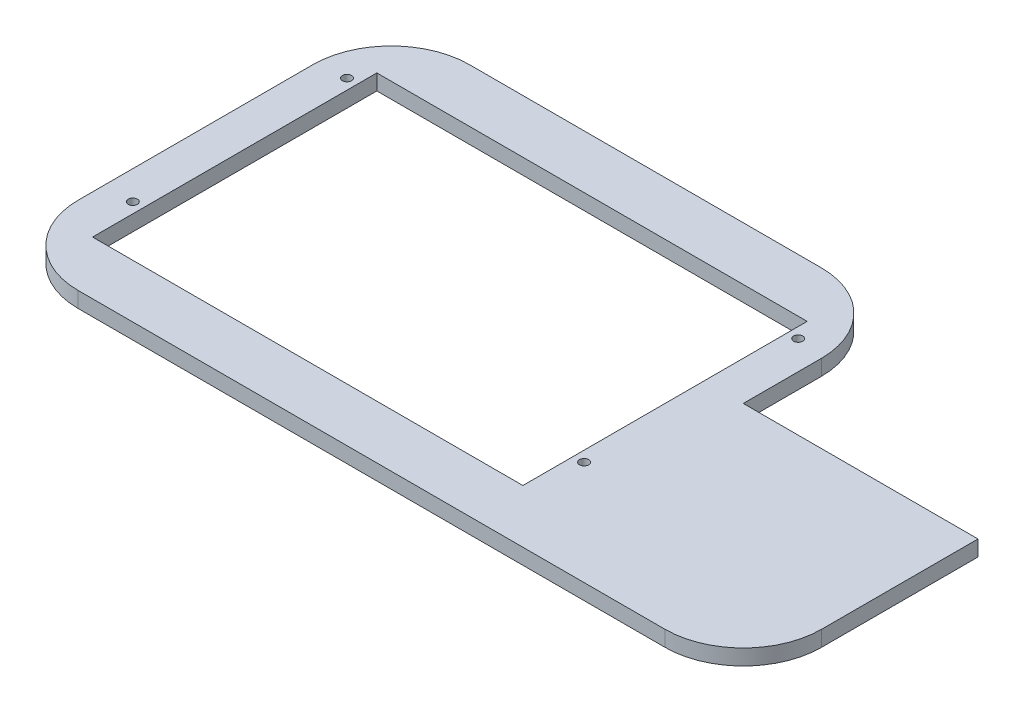
ISO-10303-21;
HEADER;
FILE_DESCRIPTION(('STEP AP214'),'2;1');
FILE_NAME('part.step','',(''),(''),'','','');
FILE_SCHEMA(('AUTOMOTIVE_DESIGN { 1 0 10303 214 1 1 1 1 }'));
ENDSEC;
DATA;
#1=APPLICATION_CONTEXT('core data for automotive mechanical design processes');
#2=APPLICATION_PROTOCOL_DEFINITION('international standard','automotive_design',2000,#1);
#3=PRODUCT_CONTEXT('',#1,'mechanical');
#4=PRODUCT('Part','Part','',(#3));
#5=PRODUCT_RELATED_PRODUCT_CATEGORY('part','',(#4));
#6=PRODUCT_DEFINITION_FORMATION('','',#4);
#7=PRODUCT_DEFINITION_CONTEXT('part definition',#1,'design');
#8=PRODUCT_DEFINITION('design','',#6,#7);
#9=PRODUCT_DEFINITION_SHAPE('','',#8);
#10=(LENGTH_UNIT() NAMED_UNIT(*) SI_UNIT(.MILLI.,.METRE.));
#11=(NAMED_UNIT(*) PLANE_ANGLE_UNIT() SI_UNIT($,.RADIAN.));
#12=(NAMED_UNIT(*) SI_UNIT($,.STERADIAN.) SOLID_ANGLE_UNIT());
#13=UNCERTAINTY_MEASURE_WITH_UNIT(LENGTH_MEASURE(1.E-05),#10,'distance_accuracy_value','');
#14=(GEOMETRIC_REPRESENTATION_CONTEXT(3) GLOBAL_UNCERTAINTY_ASSIGNED_CONTEXT((#13)) GLOBAL_UNIT_ASSIGNED_CONTEXT((#10,
#11,#12)) REPRESENTATION_CONTEXT('',''));
#15=CARTESIAN_POINT('',(0.,0.,0.));
#16=DIRECTION('',(0.,0.,1.));
#17=DIRECTION('',(1.,0.,0.));
#18=AXIS2_PLACEMENT_3D('',#15,#16,#17);
#19=CARTESIAN_POINT('',(30.,6.,-30.));
#20=DIRECTION('',(0.,1.,0.));
#21=DIRECTION('',(0.,0.,1.));
#22=AXIS2_PLACEMENT_3D('',#19,#20,#21);
#23=PLANE('',#22);
#24=CARTESIAN_POINT('',(184.,6.,-122.05));
#25=DIRECTION('',(0.,1.,0.));
#26=DIRECTION('',(0.,0.,-1.));
#27=AXIS2_PLACEMENT_3D('',#24,#25,#26);
#28=CIRCLE('',#27,1.74999999999998);
#29=CARTESIAN_POINT('',(184.,6.,-123.8));
#30=VERTEX_POINT('',#29);
#31=EDGE_CURVE('E467',#30,#30,#28,.T.);
#32=ORIENTED_EDGE('',*,*,#31,.F.);
#33=EDGE_LOOP('',(#32));
#34=FACE_BOUND('',#33,.T.);
#35=CARTESIAN_POINT('',(184.,6.,-39.95));
#36=DIRECTION('',(0.,1.,0.));
#37=DIRECTION('',(0.,0.,1.));
#38=AXIS2_PLACEMENT_3D('',#35,#36,#37);
#39=CIRCLE('',#38,1.74999999999998);
#40=CARTESIAN_POINT('',(184.,6.,-38.2));
#41=VERTEX_POINT('',#40);
#42=EDGE_CURVE('E471',#41,#41,#39,.T.);
#43=ORIENTED_EDGE('',*,*,#42,.F.);
#44=EDGE_LOOP('',(#43));
#45=FACE_BOUND('',#44,.T.);
#46=CARTESIAN_POINT('',(11.,6.,-39.95));
#47=DIRECTION('',(0.,1.,0.));
#48=DIRECTION('',(0.,0.,-1.));
#49=AXIS2_PLACEMENT_3D('',#46,#47,#48);
#50=CIRCLE('',#49,1.75);
#51=CARTESIAN_POINT('',(11.,6.,-41.7));
#52=VERTEX_POINT('',#51);
#53=EDGE_CURVE('E481',#52,#52,#50,.T.);
#54=ORIENTED_EDGE('',*,*,#53,.F.);
#55=EDGE_LOOP('',(#54));
#56=FACE_BOUND('',#55,.T.);
#57=CARTESIAN_POINT('',(11.,6.,-122.05));
#58=DIRECTION('',(0.,1.,0.));
#59=DIRECTION('',(0.,0.,1.));
#60=AXIS2_PLACEMENT_3D('',#57,#58,#59);
#61=CIRCLE('',#60,1.75);
#62=CARTESIAN_POINT('',(11.,6.,-120.3));
#63=VERTEX_POINT('',#62);
#64=EDGE_CURVE('E166',#63,#63,#61,.T.);
#65=ORIENTED_EDGE('',*,*,#64,.F.);
#66=EDGE_LOOP('',(#65));
#67=FACE_BOUND('',#66,.T.);
#68=CARTESIAN_POINT('',(30.,6.,-30.));
#69=DIRECTION('',(0.,1.,0.));
#70=DIRECTION('',(0.,0.,1.));
#71=AXIS2_PLACEMENT_3D('',#68,#69,#70);
#72=CIRCLE('',#71,30.);
#73=CARTESIAN_POINT('',(0.,6.,-30.0000000000002));
#74=VERTEX_POINT('',#73);
#75=CARTESIAN_POINT('',(30.0000000000002,6.,0.));
#76=VERTEX_POINT('',#75);
#77=EDGE_CURVE('E176',#74,#76,#72,.T.);
#78=ORIENTED_EDGE('',*,*,#77,.T.);
#79=DIRECTION('',(1.,0.,0.));
#80=VECTOR('',#79,1.);
#81=CARTESIAN_POINT('',(30.0000000000002,6.,0.));
#82=LINE('',#81,#80);
#83=CARTESIAN_POINT('',(255.,6.,0.));
#84=VERTEX_POINT('',#83);
#85=EDGE_CURVE('E179',#76,#84,#82,.T.);
#86=ORIENTED_EDGE('',*,*,#85,.T.);
#87=CARTESIAN_POINT('',(255.,6.,-30.));
#88=DIRECTION('',(0.,1.,0.));
#89=DIRECTION('',(0.,0.,1.));
#90=AXIS2_PLACEMENT_3D('',#87,#88,#89);
#91=CIRCLE('',#90,30.);
#92=CARTESIAN_POINT('',(285.,6.,-30.0000000000002));
#93=VERTEX_POINT('',#92);
#94=EDGE_CURVE('E182',#84,#93,#91,.T.);
#95=ORIENTED_EDGE('',*,*,#94,.T.);
#96=DIRECTION('',(0.,0.,-1.));
#97=VECTOR('',#96,1.);
#98=CARTESIAN_POINT('',(285.,6.,-90.));
#99=LINE('',#98,#97);
#100=CARTESIAN_POINT('',(285.,6.,-90.));
#101=VERTEX_POINT('',#100);
#102=EDGE_CURVE('E184',#93,#101,#99,.T.);
#103=ORIENTED_EDGE('',*,*,#102,.T.);
#104=DIRECTION('',(-1.,0.,0.));
#105=VECTOR('',#104,1.);
#106=CARTESIAN_POINT('',(195.,6.,-90.));
#107=LINE('',#106,#105);
#108=CARTESIAN_POINT('',(195.,6.,-90.));
#109=VERTEX_POINT('',#108);
#110=EDGE_CURVE('E186',#101,#109,#107,.T.);
#111=ORIENTED_EDGE('',*,*,#110,.T.);
#112=DIRECTION('',(0.,0.,-1.));
#113=VECTOR('',#112,1.);
#114=CARTESIAN_POINT('',(195.,6.,-120.));
#115=LINE('',#114,#113);
#116=CARTESIAN_POINT('',(195.,6.,-120.));
#117=VERTEX_POINT('',#116);
#118=EDGE_CURVE('E188',#109,#117,#115,.T.);
#119=ORIENTED_EDGE('',*,*,#118,.T.);
#120=CARTESIAN_POINT('',(165.,6.,-120.));
#121=DIRECTION('',(0.,1.,0.));
#122=DIRECTION('',(0.,0.,1.));
#123=AXIS2_PLACEMENT_3D('',#120,#121,#122);
#124=CIRCLE('',#123,30.);
#125=CARTESIAN_POINT('',(165.,6.,-150.));
#126=VERTEX_POINT('',#125);
#127=EDGE_CURVE('E190',#117,#126,#124,.T.);
#128=ORIENTED_EDGE('',*,*,#127,.T.);
#129=DIRECTION('',(-1.,0.,0.));
#130=VECTOR('',#129,1.);
#131=CARTESIAN_POINT('',(30.0000000000002,6.,-150.));
#132=LINE('',#131,#130);
#133=CARTESIAN_POINT('',(30.0000000000002,6.,-150.));
#134=VERTEX_POINT('',#133);
#135=EDGE_CURVE('E192',#126,#134,#132,.T.);
#136=ORIENTED_EDGE('',*,*,#135,.T.);
#137=CARTESIAN_POINT('',(30.,6.,-120.));
#138=DIRECTION('',(0.,1.,0.));
#139=DIRECTION('',(0.,0.,1.));
#140=AXIS2_PLACEMENT_3D('',#137,#138,#139);
#141=CIRCLE('',#140,30.);
#142=CARTESIAN_POINT('',(0.,6.,-120.));
#143=VERTEX_POINT('',#142);
#144=EDGE_CURVE('E194',#134,#143,#141,.T.);
#145=ORIENTED_EDGE('',*,*,#144,.T.);
#146=DIRECTION('',(0.,0.,1.));
#147=VECTOR('',#146,1.);
#148=CARTESIAN_POINT('',(0.,6.,-120.));
#149=LINE('',#148,#147);
#150=EDGE_CURVE('E196',#143,#74,#149,.T.);
#151=ORIENTED_EDGE('',*,*,#150,.T.);
#152=EDGE_LOOP('',(#78,#86,#95,#103,#111,#119,#128,#136,#145,#151));
#153=FACE_BOUND('',#152,.T.);
#154=DIRECTION('',(1.,0.,0.));
#155=VECTOR('',#154,1.);
#156=CARTESIAN_POINT('',(15.,6.,-20.5));
#157=LINE('',#156,#155);
#158=CARTESIAN_POINT('',(15.,6.,-20.5));
#159=VERTEX_POINT('',#158);
#160=CARTESIAN_POINT('',(180.,6.,-20.5));
#161=VERTEX_POINT('',#160);
#162=EDGE_CURVE('E146',#159,#161,#157,.T.);
#163=ORIENTED_EDGE('',*,*,#162,.F.);
#164=DIRECTION('',(0.,0.,1.));
#165=VECTOR('',#164,1.);
#166=CARTESIAN_POINT('',(15.,6.,-129.5));
#167=LINE('',#166,#165);
#168=CARTESIAN_POINT('',(15.,6.,-129.5));
#169=VERTEX_POINT('',#168);
#170=EDGE_CURVE('E138',#169,#159,#167,.T.);
#171=ORIENTED_EDGE('',*,*,#170,.F.);
#172=DIRECTION('',(-1.,0.,0.));
#173=VECTOR('',#172,1.);
#174=CARTESIAN_POINT('',(15.,6.,-129.5));
#175=LINE('',#174,#173);
#176=CARTESIAN_POINT('',(180.,6.,-129.5));
#177=VERTEX_POINT('',#176);
#178=EDGE_CURVE('E160',#177,#169,#175,.T.);
#179=ORIENTED_EDGE('',*,*,#178,.F.);
#180=DIRECTION('',(0.,0.,-1.));
#181=VECTOR('',#180,1.);
#182=CARTESIAN_POINT('',(180.,6.,-129.5));
#183=LINE('',#182,#181);
#184=EDGE_CURVE('E158',#161,#177,#183,.T.);
#185=ORIENTED_EDGE('',*,*,#184,.F.);
#186=EDGE_LOOP('',(#163,#171,#179,#185));
#187=FACE_BOUND('',#186,.T.);
#188=ADVANCED_FACE('F37',(#34,#45,#56,#67,#153,#187),#23,.T.);
#189=CARTESIAN_POINT('',(30.,0.,-30.));
#190=DIRECTION('',(0.,1.,0.));
#191=DIRECTION('',(0.,0.,1.));
#192=AXIS2_PLACEMENT_3D('',#189,#190,#191);
#193=PLANE('',#192);
#194=CARTESIAN_POINT('',(184.,0.,-122.05));
#195=DIRECTION('',(0.,1.,0.));
#196=DIRECTION('',(0.,0.,-1.));
#197=AXIS2_PLACEMENT_3D('',#194,#195,#196);
#198=CIRCLE('',#197,1.74999999999998);
#199=CARTESIAN_POINT('',(184.,0.,-123.8));
#200=VERTEX_POINT('',#199);
#201=EDGE_CURVE('E470',#200,#200,#198,.T.);
#202=ORIENTED_EDGE('',*,*,#201,.T.);
#203=EDGE_LOOP('',(#202));
#204=FACE_BOUND('',#203,.T.);
#205=CARTESIAN_POINT('',(184.,0.,-39.95));
#206=DIRECTION('',(0.,1.,0.));
#207=DIRECTION('',(0.,0.,1.));
#208=AXIS2_PLACEMENT_3D('',#205,#206,#207);
#209=CIRCLE('',#208,1.74999999999998);
#210=CARTESIAN_POINT('',(184.,0.,-38.2));
#211=VERTEX_POINT('',#210);
#212=EDGE_CURVE('E476',#211,#211,#209,.T.);
#213=ORIENTED_EDGE('',*,*,#212,.T.);
#214=EDGE_LOOP('',(#213));
#215=FACE_BOUND('',#214,.T.);
#216=CARTESIAN_POINT('',(11.,0.,-39.95));
#217=DIRECTION('',(0.,1.,0.));
#218=DIRECTION('',(0.,0.,-1.));
#219=AXIS2_PLACEMENT_3D('',#216,#217,#218);
#220=CIRCLE('',#219,1.75);
#221=CARTESIAN_POINT('',(11.,0.,-41.7));
#222=VERTEX_POINT('',#221);
#223=EDGE_CURVE('E484',#222,#222,#220,.T.);
#224=ORIENTED_EDGE('',*,*,#223,.T.);
#225=EDGE_LOOP('',(#224));
#226=FACE_BOUND('',#225,.T.);
#227=CARTESIAN_POINT('',(11.,0.,-122.05));
#228=DIRECTION('',(0.,1.,0.));
#229=DIRECTION('',(0.,0.,1.));
#230=AXIS2_PLACEMENT_3D('',#227,#228,#229);
#231=CIRCLE('',#230,1.75);
#232=CARTESIAN_POINT('',(11.,0.,-120.3));
#233=VERTEX_POINT('',#232);
#234=EDGE_CURVE('E473',#233,#233,#231,.T.);
#235=ORIENTED_EDGE('',*,*,#234,.T.);
#236=EDGE_LOOP('',(#235));
#237=FACE_BOUND('',#236,.T.);
#238=CARTESIAN_POINT('',(30.,0.,-30.));
#239=DIRECTION('',(0.,1.,0.));
#240=DIRECTION('',(0.,0.,1.));
#241=AXIS2_PLACEMENT_3D('',#238,#239,#240);
#242=CIRCLE('',#241,30.);
#243=CARTESIAN_POINT('',(0.,0.,-30.0000000000002));
#244=VERTEX_POINT('',#243);
#245=CARTESIAN_POINT('',(30.0000000000002,0.,0.));
#246=VERTEX_POINT('',#245);
#247=EDGE_CURVE('E154',#244,#246,#242,.T.);
#248=ORIENTED_EDGE('',*,*,#247,.F.);
#249=DIRECTION('',(0.,0.,1.));
#250=VECTOR('',#249,1.);
#251=CARTESIAN_POINT('',(0.,0.,-120.));
#252=LINE('',#251,#250);
#253=CARTESIAN_POINT('',(0.,0.,-120.));
#254=VERTEX_POINT('',#253);
#255=EDGE_CURVE('E180',#254,#244,#252,.T.);
#256=ORIENTED_EDGE('',*,*,#255,.F.);
#257=CARTESIAN_POINT('',(30.,0.,-120.));
#258=DIRECTION('',(0.,1.,0.));
#259=DIRECTION('',(0.,0.,1.));
#260=AXIS2_PLACEMENT_3D('',#257,#258,#259);
#261=CIRCLE('',#260,30.);
#262=CARTESIAN_POINT('',(30.0000000000002,0.,-150.));
#263=VERTEX_POINT('',#262);
#264=EDGE_CURVE('E215',#263,#254,#261,.T.);
#265=ORIENTED_EDGE('',*,*,#264,.F.);
#266=DIRECTION('',(-1.,0.,0.));
#267=VECTOR('',#266,1.);
#268=CARTESIAN_POINT('',(30.0000000000002,0.,-150.));
#269=LINE('',#268,#267);
#270=CARTESIAN_POINT('',(165.,0.,-150.));
#271=VERTEX_POINT('',#270);
#272=EDGE_CURVE('E213',#271,#263,#269,.T.);
#273=ORIENTED_EDGE('',*,*,#272,.F.);
#274=CARTESIAN_POINT('',(165.,0.,-120.));
#275=DIRECTION('',(0.,1.,0.));
#276=DIRECTION('',(0.,0.,1.));
#277=AXIS2_PLACEMENT_3D('',#274,#275,#276);
#278=CIRCLE('',#277,30.);
#279=CARTESIAN_POINT('',(195.,0.,-120.));
#280=VERTEX_POINT('',#279);
#281=EDGE_CURVE('E211',#280,#271,#278,.T.);
#282=ORIENTED_EDGE('',*,*,#281,.F.);
#283=DIRECTION('',(0.,0.,-1.));
#284=VECTOR('',#283,1.);
#285=CARTESIAN_POINT('',(195.,0.,-120.));
#286=LINE('',#285,#284);
#287=CARTESIAN_POINT('',(195.,0.,-90.));
#288=VERTEX_POINT('',#287);
#289=EDGE_CURVE('E209',#288,#280,#286,.T.);
#290=ORIENTED_EDGE('',*,*,#289,.F.);
#291=DIRECTION('',(-1.,0.,0.));
#292=VECTOR('',#291,1.);
#293=CARTESIAN_POINT('',(195.,0.,-90.));
#294=LINE('',#293,#292);
#295=CARTESIAN_POINT('',(285.,0.,-90.));
#296=VERTEX_POINT('',#295);
#297=EDGE_CURVE('E207',#296,#288,#294,.T.);
#298=ORIENTED_EDGE('',*,*,#297,.F.);
#299=DIRECTION('',(0.,0.,-1.));
#300=VECTOR('',#299,1.);
#301=CARTESIAN_POINT('',(285.,0.,-90.));
#302=LINE('',#301,#300);
#303=CARTESIAN_POINT('',(285.,0.,-30.0000000000002));
#304=VERTEX_POINT('',#303);
#305=EDGE_CURVE('E205',#304,#296,#302,.T.);
#306=ORIENTED_EDGE('',*,*,#305,.F.);
#307=CARTESIAN_POINT('',(255.,0.,-30.));
#308=DIRECTION('',(0.,1.,0.));
#309=DIRECTION('',(0.,0.,1.));
#310=AXIS2_PLACEMENT_3D('',#307,#308,#309);
#311=CIRCLE('',#310,30.);
#312=CARTESIAN_POINT('',(255.,0.,0.));
#313=VERTEX_POINT('',#312);
#314=EDGE_CURVE('E203',#313,#304,#311,.T.);
#315=ORIENTED_EDGE('',*,*,#314,.F.);
#316=DIRECTION('',(1.,0.,0.));
#317=VECTOR('',#316,1.);
#318=CARTESIAN_POINT('',(30.0000000000002,0.,0.));
#319=LINE('',#318,#317);
#320=EDGE_CURVE('E201',#246,#313,#319,.T.);
#321=ORIENTED_EDGE('',*,*,#320,.F.);
#322=EDGE_LOOP('',(#248,#256,#265,#273,#282,#290,#298,#306,#315,#321));
#323=FACE_BOUND('',#322,.T.);
#324=DIRECTION('',(0.,0.,1.));
#325=VECTOR('',#324,1.);
#326=CARTESIAN_POINT('',(15.,0.,-129.5));
#327=LINE('',#326,#325);
#328=CARTESIAN_POINT('',(15.,0.,-129.5));
#329=VERTEX_POINT('',#328);
#330=CARTESIAN_POINT('',(15.,0.,-20.5));
#331=VERTEX_POINT('',#330);
#332=EDGE_CURVE('E60',#329,#331,#327,.T.);
#333=ORIENTED_EDGE('',*,*,#332,.T.);
#334=DIRECTION('',(1.,0.,0.));
#335=VECTOR('',#334,1.);
#336=CARTESIAN_POINT('',(15.,0.,-20.5));
#337=LINE('',#336,#335);
#338=CARTESIAN_POINT('',(180.,0.,-20.5));
#339=VERTEX_POINT('',#338);
#340=EDGE_CURVE('E153',#331,#339,#337,.T.);
#341=ORIENTED_EDGE('',*,*,#340,.T.);
#342=DIRECTION('',(0.,0.,-1.));
#343=VECTOR('',#342,1.);
#344=CARTESIAN_POINT('',(180.,0.,-129.5));
#345=LINE('',#344,#343);
#346=CARTESIAN_POINT('',(180.,0.,-129.5));
#347=VERTEX_POINT('',#346);
#348=EDGE_CURVE('E168',#339,#347,#345,.T.);
#349=ORIENTED_EDGE('',*,*,#348,.T.);
#350=DIRECTION('',(-1.,0.,0.));
#351=VECTOR('',#350,1.);
#352=CARTESIAN_POINT('',(15.,0.,-129.5));
#353=LINE('',#352,#351);
#354=EDGE_CURVE('E147',#347,#329,#353,.T.);
#355=ORIENTED_EDGE('',*,*,#354,.T.);
#356=EDGE_LOOP('',(#333,#341,#349,#355));
#357=FACE_BOUND('',#356,.T.);
#358=ADVANCED_FACE('F251',(#204,#215,#226,#237,#323,#357),#193,.F.);
#359=CARTESIAN_POINT('',(30.,6.,-30.));
#360=DIRECTION('',(0.,-1.,0.));
#361=DIRECTION('',(0.,0.,-1.));
#362=AXIS2_PLACEMENT_3D('',#359,#360,#361);
#363=CYLINDRICAL_SURFACE('',#362,30.);
#364=ORIENTED_EDGE('',*,*,#247,.T.);
#365=DIRECTION('',(0.,-1.,0.));
#366=VECTOR('',#365,1.);
#367=CARTESIAN_POINT('',(30.0000000000002,6.,0.));
#368=LINE('',#367,#366);
#369=EDGE_CURVE('E11',#76,#246,#368,.T.);
#370=ORIENTED_EDGE('',*,*,#369,.F.);
#371=ORIENTED_EDGE('',*,*,#77,.F.);
#372=DIRECTION('',(0.,-1.,0.));
#373=VECTOR('',#372,1.);
#374=CARTESIAN_POINT('',(0.,6.,-30.0000000000002));
#375=LINE('',#374,#373);
#376=EDGE_CURVE('E198',#74,#244,#375,.T.);
#377=ORIENTED_EDGE('',*,*,#376,.T.);
#378=EDGE_LOOP('',(#364,#370,#371,#377));
#379=FACE_BOUND('',#378,.T.);
#380=ADVANCED_FACE('F39',(#379),#363,.T.);
#381=CARTESIAN_POINT('',(30.0000000000002,6.,0.));
#382=DIRECTION('',(0.,0.,-1.));
#383=DIRECTION('',(-1.,0.,0.));
#384=AXIS2_PLACEMENT_3D('',#381,#382,#383);
#385=PLANE('',#384);
#386=ORIENTED_EDGE('',*,*,#320,.T.);
#387=DIRECTION('',(0.,-1.,0.));
#388=VECTOR('',#387,1.);
#389=CARTESIAN_POINT('',(255.,6.,0.));
#390=LINE('',#389,#388);
#391=EDGE_CURVE('E45',#84,#313,#390,.T.);
#392=ORIENTED_EDGE('',*,*,#391,.F.);
#393=ORIENTED_EDGE('',*,*,#85,.F.);
#394=ORIENTED_EDGE('',*,*,#369,.T.);
#395=EDGE_LOOP('',(#386,#392,#393,#394));
#396=FACE_BOUND('',#395,.T.);
#397=ADVANCED_FACE('F268',(#396),#385,.F.);
#398=CARTESIAN_POINT('',(255.,6.,-30.));
#399=DIRECTION('',(0.,-1.,0.));
#400=DIRECTION('',(0.,0.,-1.));
#401=AXIS2_PLACEMENT_3D('',#398,#399,#400);
#402=CYLINDRICAL_SURFACE('',#401,30.);
#403=ORIENTED_EDGE('',*,*,#314,.T.);
#404=DIRECTION('',(0.,-1.,0.));
#405=VECTOR('',#404,1.);
#406=CARTESIAN_POINT('',(285.,6.,-30.0000000000002));
#407=LINE('',#406,#405);
#408=EDGE_CURVE('E238',#93,#304,#407,.T.);
#409=ORIENTED_EDGE('',*,*,#408,.F.);
#410=ORIENTED_EDGE('',*,*,#94,.F.);
#411=ORIENTED_EDGE('',*,*,#391,.T.);
#412=EDGE_LOOP('',(#403,#409,#410,#411));
#413=FACE_BOUND('',#412,.T.);
#414=ADVANCED_FACE('F245',(#413),#402,.T.);
#415=CARTESIAN_POINT('',(285.,6.,-90.));
#416=DIRECTION('',(-1.,0.,0.));
#417=DIRECTION('',(0.,0.,1.));
#418=AXIS2_PLACEMENT_3D('',#415,#416,#417);
#419=PLANE('',#418);
#420=ORIENTED_EDGE('',*,*,#305,.T.);
#421=DIRECTION('',(0.,-1.,0.));
#422=VECTOR('',#421,1.);
#423=CARTESIAN_POINT('',(285.,6.,-90.));
#424=LINE('',#423,#422);
#425=EDGE_CURVE('E235',#101,#296,#424,.T.);
#426=ORIENTED_EDGE('',*,*,#425,.F.);
#427=ORIENTED_EDGE('',*,*,#102,.F.);
#428=ORIENTED_EDGE('',*,*,#408,.T.);
#429=EDGE_LOOP('',(#420,#426,#427,#428));
#430=FACE_BOUND('',#429,.T.);
#431=ADVANCED_FACE('F257',(#430),#419,.F.);
#432=CARTESIAN_POINT('',(195.,6.,-90.));
#433=DIRECTION('',(0.,0.,1.));
#434=DIRECTION('',(1.,0.,0.));
#435=AXIS2_PLACEMENT_3D('',#432,#433,#434);
#436=PLANE('',#435);
#437=ORIENTED_EDGE('',*,*,#297,.T.);
#438=DIRECTION('',(0.,-1.,0.));
#439=VECTOR('',#438,1.);
#440=CARTESIAN_POINT('',(195.,6.,-90.));
#441=LINE('',#440,#439);
#442=EDGE_CURVE('E232',#109,#288,#441,.T.);
#443=ORIENTED_EDGE('',*,*,#442,.F.);
#444=ORIENTED_EDGE('',*,*,#110,.F.);
#445=ORIENTED_EDGE('',*,*,#425,.T.);
#446=EDGE_LOOP('',(#437,#443,#444,#445));
#447=FACE_BOUND('',#446,.T.);
#448=ADVANCED_FACE('F261',(#447),#436,.F.);
#449=CARTESIAN_POINT('',(195.,6.,-120.));
#450=DIRECTION('',(-1.,0.,0.));
#451=DIRECTION('',(0.,0.,1.));
#452=AXIS2_PLACEMENT_3D('',#449,#450,#451);
#453=PLANE('',#452);
#454=ORIENTED_EDGE('',*,*,#289,.T.);
#455=DIRECTION('',(0.,-1.,0.));
#456=VECTOR('',#455,1.);
#457=CARTESIAN_POINT('',(195.,6.,-120.));
#458=LINE('',#457,#456);
#459=EDGE_CURVE('E229',#117,#280,#458,.T.);
#460=ORIENTED_EDGE('',*,*,#459,.F.);
#461=ORIENTED_EDGE('',*,*,#118,.F.);
#462=ORIENTED_EDGE('',*,*,#442,.T.);
#463=EDGE_LOOP('',(#454,#460,#461,#462));
#464=FACE_BOUND('',#463,.T.);
#465=ADVANCED_FACE('F291',(#464),#453,.F.);
#466=CARTESIAN_POINT('',(165.,6.,-120.));
#467=DIRECTION('',(0.,-1.,0.));
#468=DIRECTION('',(0.,0.,-1.));
#469=AXIS2_PLACEMENT_3D('',#466,#467,#468);
#470=CYLINDRICAL_SURFACE('',#469,30.);
#471=ORIENTED_EDGE('',*,*,#281,.T.);
#472=DIRECTION('',(0.,-1.,0.));
#473=VECTOR('',#472,1.);
#474=CARTESIAN_POINT('',(165.,6.,-150.));
#475=LINE('',#474,#473);
#476=EDGE_CURVE('E226',#126,#271,#475,.T.);
#477=ORIENTED_EDGE('',*,*,#476,.F.);
#478=ORIENTED_EDGE('',*,*,#127,.F.);
#479=ORIENTED_EDGE('',*,*,#459,.T.);
#480=EDGE_LOOP('',(#471,#477,#478,#479));
#481=FACE_BOUND('',#480,.T.);
#482=ADVANCED_FACE('F288',(#481),#470,.T.);
#483=CARTESIAN_POINT('',(30.0000000000002,6.,-150.));
#484=DIRECTION('',(0.,0.,1.));
#485=DIRECTION('',(1.,0.,0.));
#486=AXIS2_PLACEMENT_3D('',#483,#484,#485);
#487=PLANE('',#486);
#488=ORIENTED_EDGE('',*,*,#272,.T.);
#489=DIRECTION('',(0.,-1.,0.));
#490=VECTOR('',#489,1.);
#491=CARTESIAN_POINT('',(30.0000000000002,6.,-150.));
#492=LINE('',#491,#490);
#493=EDGE_CURVE('E223',#134,#263,#492,.T.);
#494=ORIENTED_EDGE('',*,*,#493,.F.);
#495=ORIENTED_EDGE('',*,*,#135,.F.);
#496=ORIENTED_EDGE('',*,*,#476,.T.);
#497=EDGE_LOOP('',(#488,#494,#495,#496));
#498=FACE_BOUND('',#497,.T.);
#499=ADVANCED_FACE('F284',(#498),#487,.F.);
#500=CARTESIAN_POINT('',(30.,6.,-120.));
#501=DIRECTION('',(0.,-1.,0.));
#502=DIRECTION('',(0.,0.,-1.));
#503=AXIS2_PLACEMENT_3D('',#500,#501,#502);
#504=CYLINDRICAL_SURFACE('',#503,30.);
#505=ORIENTED_EDGE('',*,*,#264,.T.);
#506=DIRECTION('',(0.,-1.,0.));
#507=VECTOR('',#506,1.);
#508=CARTESIAN_POINT('',(0.,6.,-120.));
#509=LINE('',#508,#507);
#510=EDGE_CURVE('E220',#143,#254,#509,.T.);
#511=ORIENTED_EDGE('',*,*,#510,.F.);
#512=ORIENTED_EDGE('',*,*,#144,.F.);
#513=ORIENTED_EDGE('',*,*,#493,.T.);
#514=EDGE_LOOP('',(#505,#511,#512,#513));
#515=FACE_BOUND('',#514,.T.);
#516=ADVANCED_FACE('F280',(#515),#504,.T.);
#517=CARTESIAN_POINT('',(0.,6.,-120.));
#518=DIRECTION('',(1.,0.,0.));
#519=DIRECTION('',(0.,0.,-1.));
#520=AXIS2_PLACEMENT_3D('',#517,#518,#519);
#521=PLANE('',#520);
#522=ORIENTED_EDGE('',*,*,#255,.T.);
#523=ORIENTED_EDGE('',*,*,#376,.F.);
#524=ORIENTED_EDGE('',*,*,#150,.F.);
#525=ORIENTED_EDGE('',*,*,#510,.T.);
#526=EDGE_LOOP('',(#522,#523,#524,#525));
#527=FACE_BOUND('',#526,.T.);
#528=ADVANCED_FACE('F275',(#527),#521,.F.);
#529=CARTESIAN_POINT('',(15.,6.,-129.5));
#530=DIRECTION('',(1.,0.,0.));
#531=DIRECTION('',(0.,0.,-1.));
#532=AXIS2_PLACEMENT_3D('',#529,#530,#531);
#533=PLANE('',#532);
#534=ORIENTED_EDGE('',*,*,#332,.F.);
#535=DIRECTION('',(0.,-1.,0.));
#536=VECTOR('',#535,1.);
#537=CARTESIAN_POINT('',(15.,6.,-129.5));
#538=LINE('',#537,#536);
#539=EDGE_CURVE('E142',#169,#329,#538,.T.);
#540=ORIENTED_EDGE('',*,*,#539,.F.);
#541=ORIENTED_EDGE('',*,*,#170,.T.);
#542=DIRECTION('',(0.,-1.,0.));
#543=VECTOR('',#542,1.);
#544=CARTESIAN_POINT('',(15.,6.,-20.5));
#545=LINE('',#544,#543);
#546=EDGE_CURVE('E141',#159,#331,#545,.T.);
#547=ORIENTED_EDGE('',*,*,#546,.T.);
#548=EDGE_LOOP('',(#534,#540,#541,#547));
#549=FACE_BOUND('',#548,.T.);
#550=ADVANCED_FACE('F140',(#549),#533,.T.);
#551=CARTESIAN_POINT('',(15.,6.,-20.5));
#552=DIRECTION('',(0.,0.,-1.));
#553=DIRECTION('',(-1.,0.,0.));
#554=AXIS2_PLACEMENT_3D('',#551,#552,#553);
#555=PLANE('',#554);
#556=ORIENTED_EDGE('',*,*,#340,.F.);
#557=ORIENTED_EDGE('',*,*,#546,.F.);
#558=ORIENTED_EDGE('',*,*,#162,.T.);
#559=DIRECTION('',(0.,-1.,0.));
#560=VECTOR('',#559,1.);
#561=CARTESIAN_POINT('',(180.,6.,-20.5));
#562=LINE('',#561,#560);
#563=EDGE_CURVE('E155',#161,#339,#562,.T.);
#564=ORIENTED_EDGE('',*,*,#563,.T.);
#565=EDGE_LOOP('',(#556,#557,#558,#564));
#566=FACE_BOUND('',#565,.T.);
#567=ADVANCED_FACE('F150',(#566),#555,.T.);
#568=CARTESIAN_POINT('',(180.,6.,-129.5));
#569=DIRECTION('',(-1.,0.,0.));
#570=DIRECTION('',(0.,0.,1.));
#571=AXIS2_PLACEMENT_3D('',#568,#569,#570);
#572=PLANE('',#571);
#573=ORIENTED_EDGE('',*,*,#348,.F.);
#574=ORIENTED_EDGE('',*,*,#563,.F.);
#575=ORIENTED_EDGE('',*,*,#184,.T.);
#576=DIRECTION('',(0.,-1.,0.));
#577=VECTOR('',#576,1.);
#578=CARTESIAN_POINT('',(180.,6.,-129.5));
#579=LINE('',#578,#577);
#580=EDGE_CURVE('E52',#177,#347,#579,.T.);
#581=ORIENTED_EDGE('',*,*,#580,.T.);
#582=EDGE_LOOP('',(#573,#574,#575,#581));
#583=FACE_BOUND('',#582,.T.);
#584=ADVANCED_FACE('F341',(#583),#572,.T.);
#585=CARTESIAN_POINT('',(15.,6.,-129.5));
#586=DIRECTION('',(0.,0.,1.));
#587=DIRECTION('',(1.,0.,0.));
#588=AXIS2_PLACEMENT_3D('',#585,#586,#587);
#589=PLANE('',#588);
#590=ORIENTED_EDGE('',*,*,#354,.F.);
#591=ORIENTED_EDGE('',*,*,#580,.F.);
#592=ORIENTED_EDGE('',*,*,#178,.T.);
#593=ORIENTED_EDGE('',*,*,#539,.T.);
#594=EDGE_LOOP('',(#590,#591,#592,#593));
#595=FACE_BOUND('',#594,.T.);
#596=ADVANCED_FACE('F347',(#595),#589,.T.);
#597=CARTESIAN_POINT('',(11.,6.,-122.05));
#598=DIRECTION('',(0.,-1.,0.));
#599=DIRECTION('',(0.,0.,-1.));
#600=AXIS2_PLACEMENT_3D('',#597,#598,#599);
#601=CYLINDRICAL_SURFACE('',#600,1.75);
#602=ORIENTED_EDGE('',*,*,#64,.T.);
#603=EDGE_LOOP('',(#602));
#604=FACE_BOUND('',#603,.T.);
#605=ORIENTED_EDGE('',*,*,#234,.F.);
#606=EDGE_LOOP('',(#605));
#607=FACE_BOUND('',#606,.T.);
#608=ADVANCED_FACE('F355',(#604,#607),#601,.F.);
#609=CARTESIAN_POINT('',(11.,6.,-39.95));
#610=DIRECTION('',(0.,-1.,0.));
#611=DIRECTION('',(0.,0.,-1.));
#612=AXIS2_PLACEMENT_3D('',#609,#610,#611);
#613=CYLINDRICAL_SURFACE('',#612,1.75);
#614=ORIENTED_EDGE('',*,*,#53,.T.);
#615=EDGE_LOOP('',(#614));
#616=FACE_BOUND('',#615,.T.);
#617=ORIENTED_EDGE('',*,*,#223,.F.);
#618=EDGE_LOOP('',(#617));
#619=FACE_BOUND('',#618,.T.);
#620=ADVANCED_FACE('F362',(#616,#619),#613,.F.);
#621=CARTESIAN_POINT('',(184.,6.,-39.95));
#622=DIRECTION('',(0.,-1.,0.));
#623=DIRECTION('',(0.,0.,-1.));
#624=AXIS2_PLACEMENT_3D('',#621,#622,#623);
#625=CYLINDRICAL_SURFACE('',#624,1.74999999999998);
#626=ORIENTED_EDGE('',*,*,#42,.T.);
#627=EDGE_LOOP('',(#626));
#628=FACE_BOUND('',#627,.T.);
#629=ORIENTED_EDGE('',*,*,#212,.F.);
#630=EDGE_LOOP('',(#629));
#631=FACE_BOUND('',#630,.T.);
#632=ADVANCED_FACE('F371',(#628,#631),#625,.F.);
#633=CARTESIAN_POINT('',(184.,6.,-122.05));
#634=DIRECTION('',(0.,-1.,0.));
#635=DIRECTION('',(0.,0.,-1.));
#636=AXIS2_PLACEMENT_3D('',#633,#634,#635);
#637=CYLINDRICAL_SURFACE('',#636,1.74999999999998);
#638=ORIENTED_EDGE('',*,*,#31,.T.);
#639=EDGE_LOOP('',(#638));
#640=FACE_BOUND('',#639,.T.);
#641=ORIENTED_EDGE('',*,*,#201,.F.);
#642=EDGE_LOOP('',(#641));
#643=FACE_BOUND('',#642,.T.);
#644=ADVANCED_FACE('F379',(#640,#643),#637,.F.);
#645=CLOSED_SHELL('',(#188,#358,#380,#397,#414,#431,#448,#465,#482,#499,#516,#528,#550,#567,
#584,#596,#608,#620,#632,#644));
#646=MANIFOLD_SOLID_BREP('B2',#645);
#647=ADVANCED_BREP_SHAPE_REPRESENTATION('',(#18,#646),#14);
#648=SHAPE_DEFINITION_REPRESENTATION(#9,#647);
ENDSEC;
END-ISO-10303-21;
